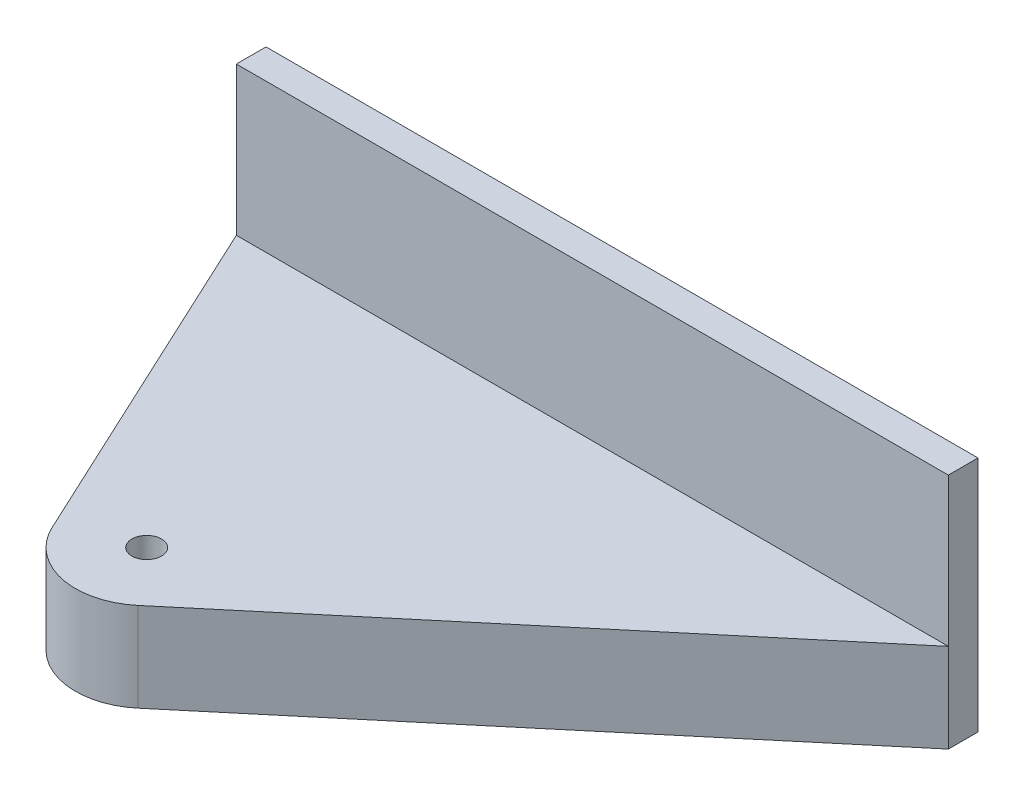
ISO-10303-21;
HEADER;
FILE_DESCRIPTION(('STEP AP214'),'2;1');
FILE_NAME('part.step','',(''),(''),'','','');
FILE_SCHEMA(('AUTOMOTIVE_DESIGN { 1 0 10303 214 1 1 1 1 }'));
ENDSEC;
DATA;
#1=APPLICATION_CONTEXT('core data for automotive mechanical design processes');
#2=APPLICATION_PROTOCOL_DEFINITION('international standard','automotive_design',2000,#1);
#3=PRODUCT_CONTEXT('',#1,'mechanical');
#4=PRODUCT('Part','Part','',(#3));
#5=PRODUCT_RELATED_PRODUCT_CATEGORY('part','',(#4));
#6=PRODUCT_DEFINITION_FORMATION('','',#4);
#7=PRODUCT_DEFINITION_CONTEXT('part definition',#1,'design');
#8=PRODUCT_DEFINITION('design','',#6,#7);
#9=PRODUCT_DEFINITION_SHAPE('','',#8);
#10=(LENGTH_UNIT() NAMED_UNIT(*) SI_UNIT(.MILLI.,.METRE.));
#11=(NAMED_UNIT(*) PLANE_ANGLE_UNIT() SI_UNIT($,.RADIAN.));
#12=(NAMED_UNIT(*) SI_UNIT($,.STERADIAN.) SOLID_ANGLE_UNIT());
#13=UNCERTAINTY_MEASURE_WITH_UNIT(LENGTH_MEASURE(1.E-05),#10,'distance_accuracy_value','');
#14=(GEOMETRIC_REPRESENTATION_CONTEXT(3) GLOBAL_UNCERTAINTY_ASSIGNED_CONTEXT((#13)) GLOBAL_UNIT_ASSIGNED_CONTEXT((#10,
#11,#12)) REPRESENTATION_CONTEXT('',''));
#15=CARTESIAN_POINT('',(0.,0.,0.));
#16=DIRECTION('',(0.,0.,1.));
#17=DIRECTION('',(1.,0.,0.));
#18=AXIS2_PLACEMENT_3D('',#15,#16,#17);
#19=CARTESIAN_POINT('',(0.,0.,3.175));
#20=DIRECTION('',(-1.,0.,0.));
#21=DIRECTION('',(0.,0.,1.));
#22=AXIS2_PLACEMENT_3D('',#19,#20,#21);
#23=PLANE('',#22);
#24=DIRECTION('',(0.,1.,0.));
#25=VECTOR('',#24,1.);
#26=CARTESIAN_POINT('',(0.,0.,3.175));
#27=LINE('',#26,#25);
#28=CARTESIAN_POINT('',(0.,9.525,3.175));
#29=VERTEX_POINT('',#28);
#30=CARTESIAN_POINT('',(0.,25.4,3.175));
#31=VERTEX_POINT('',#30);
#32=EDGE_CURVE('E135',#29,#31,#27,.T.);
#33=ORIENTED_EDGE('',*,*,#32,.F.);
#34=CARTESIAN_POINT('',(0.,0.,3.175));
#35=VERTEX_POINT('',#34);
#36=EDGE_CURVE('E117',#35,#29,#27,.T.);
#37=ORIENTED_EDGE('',*,*,#36,.F.);
#38=DIRECTION('',(0.,0.,-1.));
#39=VECTOR('',#38,1.);
#40=CARTESIAN_POINT('',(0.,0.,3.175));
#41=LINE('',#40,#39);
#42=CARTESIAN_POINT('',(0.,0.,0.));
#43=VERTEX_POINT('',#42);
#44=EDGE_CURVE('E139',#35,#43,#41,.T.);
#45=ORIENTED_EDGE('',*,*,#44,.T.);
#46=DIRECTION('',(0.,1.,0.));
#47=VECTOR('',#46,1.);
#48=CARTESIAN_POINT('',(0.,0.,0.));
#49=LINE('',#48,#47);
#50=CARTESIAN_POINT('',(0.,25.4,0.));
#51=VERTEX_POINT('',#50);
#52=EDGE_CURVE('E132',#43,#51,#49,.T.);
#53=ORIENTED_EDGE('',*,*,#52,.T.);
#54=DIRECTION('',(0.,0.,-1.));
#55=VECTOR('',#54,1.);
#56=CARTESIAN_POINT('',(0.,25.4,3.175));
#57=LINE('',#56,#55);
#58=EDGE_CURVE('E11',#31,#51,#57,.T.);
#59=ORIENTED_EDGE('',*,*,#58,.F.);
#60=EDGE_LOOP('',(#33,#37,#45,#53,#59));
#61=FACE_BOUND('',#60,.T.);
#62=ADVANCED_FACE('F35',(#61),#23,.F.);
#63=CARTESIAN_POINT('',(0.,25.4,3.175));
#64=DIRECTION('',(0.,-1.,0.));
#65=DIRECTION('',(1.,0.,0.));
#66=AXIS2_PLACEMENT_3D('',#63,#64,#65);
#67=PLANE('',#66);
#68=DIRECTION('',(-1.,0.,0.));
#69=VECTOR('',#68,1.);
#70=CARTESIAN_POINT('',(0.,25.4,0.));
#71=LINE('',#70,#69);
#72=CARTESIAN_POINT('',(-76.2,25.4,0.));
#73=VERTEX_POINT('',#72);
#74=EDGE_CURVE('E141',#51,#73,#71,.T.);
#75=ORIENTED_EDGE('',*,*,#74,.T.);
#76=DIRECTION('',(0.,0.,-1.));
#77=VECTOR('',#76,1.);
#78=CARTESIAN_POINT('',(-76.2,25.4,3.175));
#79=LINE('',#78,#77);
#80=CARTESIAN_POINT('',(-76.2,25.4,3.175));
#81=VERTEX_POINT('',#80);
#82=EDGE_CURVE('E43',#81,#73,#79,.T.);
#83=ORIENTED_EDGE('',*,*,#82,.F.);
#84=DIRECTION('',(-1.,0.,0.));
#85=VECTOR('',#84,1.);
#86=CARTESIAN_POINT('',(0.,25.4,3.175));
#87=LINE('',#86,#85);
#88=EDGE_CURVE('E134',#31,#81,#87,.T.);
#89=ORIENTED_EDGE('',*,*,#88,.F.);
#90=ORIENTED_EDGE('',*,*,#58,.T.);
#91=EDGE_LOOP('',(#75,#83,#89,#90));
#92=FACE_BOUND('',#91,.T.);
#93=ADVANCED_FACE('F169',(#92),#67,.F.);
#94=CARTESIAN_POINT('',(-76.2,0.,3.175));
#95=DIRECTION('',(1.,0.,0.));
#96=DIRECTION('',(0.,0.,-1.));
#97=AXIS2_PLACEMENT_3D('',#94,#95,#96);
#98=PLANE('',#97);
#99=DIRECTION('',(0.,-1.,0.));
#100=VECTOR('',#99,1.);
#101=CARTESIAN_POINT('',(-76.2,0.,0.));
#102=LINE('',#101,#100);
#103=CARTESIAN_POINT('',(-76.2,0.,0.));
#104=VERTEX_POINT('',#103);
#105=EDGE_CURVE('E143',#73,#104,#102,.T.);
#106=ORIENTED_EDGE('',*,*,#105,.T.);
#107=DIRECTION('',(0.,0.,-1.));
#108=VECTOR('',#107,1.);
#109=CARTESIAN_POINT('',(-76.2,0.,3.175));
#110=LINE('',#109,#108);
#111=CARTESIAN_POINT('',(-76.2,0.,3.175));
#112=VERTEX_POINT('',#111);
#113=EDGE_CURVE('E149',#112,#104,#110,.T.);
#114=ORIENTED_EDGE('',*,*,#113,.F.);
#115=DIRECTION('',(0.,-1.,0.));
#116=VECTOR('',#115,1.);
#117=CARTESIAN_POINT('',(-76.2,9.52499999999999,3.175));
#118=LINE('',#117,#116);
#119=CARTESIAN_POINT('',(-76.2,9.525,3.175));
#120=VERTEX_POINT('',#119);
#121=EDGE_CURVE('E50',#120,#112,#118,.T.);
#122=ORIENTED_EDGE('',*,*,#121,.F.);
#123=DIRECTION('',(0.,-1.,0.));
#124=VECTOR('',#123,1.);
#125=CARTESIAN_POINT('',(-76.2,0.,3.175));
#126=LINE('',#125,#124);
#127=EDGE_CURVE('E137',#81,#120,#126,.T.);
#128=ORIENTED_EDGE('',*,*,#127,.F.);
#129=ORIENTED_EDGE('',*,*,#82,.T.);
#130=EDGE_LOOP('',(#106,#114,#122,#128,#129));
#131=FACE_BOUND('',#130,.T.);
#132=ADVANCED_FACE('F155',(#131),#98,.F.);
#133=CARTESIAN_POINT('',(0.,0.,3.175));
#134=DIRECTION('',(0.,1.,0.));
#135=DIRECTION('',(-1.,0.,0.));
#136=AXIS2_PLACEMENT_3D('',#133,#134,#135);
#137=PLANE('',#136);
#138=CARTESIAN_POINT('',(-52.060542210601,0.,36.9117782230927));
#139=DIRECTION('',(0.,1.,0.));
#140=DIRECTION('',(-1.,0.,0.));
#141=AXIS2_PLACEMENT_3D('',#138,#139,#140);
#142=CIRCLE('',#141,1.5875);
#143=CARTESIAN_POINT('',(-53.648042210601,0.,36.9117782230927));
#144=VERTEX_POINT('',#143);
#145=EDGE_CURVE('E123',#144,#144,#142,.F.);
#146=ORIENTED_EDGE('',*,*,#145,.F.);
#147=EDGE_LOOP('',(#146));
#148=FACE_BOUND('',#147,.T.);
#149=DIRECTION('',(1.,0.,0.));
#150=VECTOR('',#149,1.);
#151=CARTESIAN_POINT('',(0.,0.,0.));
#152=LINE('',#151,#150);
#153=EDGE_CURVE('E145',#104,#43,#152,.T.);
#154=ORIENTED_EDGE('',*,*,#153,.T.);
#155=ORIENTED_EDGE('',*,*,#44,.F.);
#156=DIRECTION('',(-0.766044443118977,0.,0.642787609686541));
#157=VECTOR('',#156,1.);
#158=CARTESIAN_POINT('',(-47.1625006247896,0.,42.7490368796593));
#159=LINE('',#158,#157);
#160=CARTESIAN_POINT('',(-47.1625006247896,0.,42.7490368796593));
#161=VERTEX_POINT('',#160);
#162=EDGE_CURVE('E126',#35,#161,#159,.T.);
#163=ORIENTED_EDGE('',*,*,#162,.T.);
#164=CARTESIAN_POINT('',(-52.060542210601,0.,36.9117782230927));
#165=DIRECTION('',(0.,-1.,0.));
#166=DIRECTION('',(-1.,0.,0.));
#167=AXIS2_PLACEMENT_3D('',#164,#165,#166);
#168=CIRCLE('',#167,7.62);
#169=CARTESIAN_POINT('',(-58.9666075478203,0.,40.1321293775568));
#170=VERTEX_POINT('',#169);
#171=EDGE_CURVE('E100',#161,#170,#168,.T.);
#172=ORIENTED_EDGE('',*,*,#171,.T.);
#173=DIRECTION('',(-0.422618261740697,0.,-0.906307787036651));
#174=VECTOR('',#173,1.);
#175=CARTESIAN_POINT('',(-76.2,0.,3.175));
#176=LINE('',#175,#174);
#177=EDGE_CURVE('E118',#170,#112,#176,.T.);
#178=ORIENTED_EDGE('',*,*,#177,.T.);
#179=ORIENTED_EDGE('',*,*,#113,.T.);
#180=EDGE_LOOP('',(#154,#155,#163,#172,#178,#179));
#181=FACE_BOUND('',#180,.T.);
#182=ADVANCED_FACE('F165',(#148,#181),#137,.F.);
#183=CARTESIAN_POINT('',(0.,0.,3.175));
#184=DIRECTION('',(0.,0.,1.));
#185=DIRECTION('',(1.,0.,0.));
#186=AXIS2_PLACEMENT_3D('',#183,#184,#185);
#187=PLANE('',#186);
#188=DIRECTION('',(-1.,0.,0.));
#189=VECTOR('',#188,1.);
#190=CARTESIAN_POINT('',(0.,9.525,3.175));
#191=LINE('',#190,#189);
#192=EDGE_CURVE('E57',#29,#120,#191,.T.);
#193=ORIENTED_EDGE('',*,*,#192,.F.);
#194=ORIENTED_EDGE('',*,*,#32,.T.);
#195=ORIENTED_EDGE('',*,*,#88,.T.);
#196=ORIENTED_EDGE('',*,*,#127,.T.);
#197=EDGE_LOOP('',(#193,#194,#195,#196));
#198=FACE_BOUND('',#197,.T.);
#199=ADVANCED_FACE('F168',(#198),#187,.T.);
#200=CARTESIAN_POINT('',(0.,0.,0.));
#201=DIRECTION('',(0.,0.,1.));
#202=DIRECTION('',(1.,0.,0.));
#203=AXIS2_PLACEMENT_3D('',#200,#201,#202);
#204=PLANE('',#203);
#205=ORIENTED_EDGE('',*,*,#74,.F.);
#206=ORIENTED_EDGE('',*,*,#52,.F.);
#207=ORIENTED_EDGE('',*,*,#153,.F.);
#208=ORIENTED_EDGE('',*,*,#105,.F.);
#209=EDGE_LOOP('',(#205,#206,#207,#208));
#210=FACE_BOUND('',#209,.T.);
#211=ADVANCED_FACE('F161',(#210),#204,.F.);
#212=CARTESIAN_POINT('',(-76.2,9.52499999999999,3.175));
#213=DIRECTION('',(-0.906307787036651,0.,0.422618261740697));
#214=DIRECTION('',(0.422618261740697,0.,0.906307787036651));
#215=AXIS2_PLACEMENT_3D('',#212,#213,#214);
#216=PLANE('',#215);
#217=ORIENTED_EDGE('',*,*,#177,.F.);
#218=DIRECTION('',(0.,-1.,0.));
#219=VECTOR('',#218,1.);
#220=CARTESIAN_POINT('',(-58.9666075478203,9.52499999999999,40.1321293775568));
#221=LINE('',#220,#219);
#222=CARTESIAN_POINT('',(-58.9666075478203,9.52499999999999,40.1321293775568));
#223=VERTEX_POINT('',#222);
#224=EDGE_CURVE('E105',#223,#170,#221,.T.);
#225=ORIENTED_EDGE('',*,*,#224,.F.);
#226=DIRECTION('',(-0.422618261740697,0.,-0.906307787036651));
#227=VECTOR('',#226,1.);
#228=CARTESIAN_POINT('',(-76.2,9.52499999999999,3.175));
#229=LINE('',#228,#227);
#230=EDGE_CURVE('E106',#223,#120,#229,.T.);
#231=ORIENTED_EDGE('',*,*,#230,.T.);
#232=ORIENTED_EDGE('',*,*,#121,.T.);
#233=EDGE_LOOP('',(#217,#225,#231,#232));
#234=FACE_BOUND('',#233,.T.);
#235=ADVANCED_FACE('F182',(#234),#216,.T.);
#236=CARTESIAN_POINT('',(-52.060542210601,9.52499999999999,36.9117782230927));
#237=DIRECTION('',(0.,-1.,0.));
#238=DIRECTION('',(1.,0.,0.));
#239=AXIS2_PLACEMENT_3D('',#236,#237,#238);
#240=CYLINDRICAL_SURFACE('',#239,7.62);
#241=ORIENTED_EDGE('',*,*,#171,.F.);
#242=DIRECTION('',(0.,-1.,0.));
#243=VECTOR('',#242,1.);
#244=CARTESIAN_POINT('',(-47.1625006247896,9.52499999999999,42.7490368796593));
#245=LINE('',#244,#243);
#246=CARTESIAN_POINT('',(-47.1625006247896,9.52499999999999,42.7490368796593));
#247=VERTEX_POINT('',#246);
#248=EDGE_CURVE('E95',#247,#161,#245,.T.);
#249=ORIENTED_EDGE('',*,*,#248,.F.);
#250=CARTESIAN_POINT('',(-52.060542210601,9.52499999999999,36.9117782230927));
#251=DIRECTION('',(0.,-1.,0.));
#252=DIRECTION('',(-1.,0.,0.));
#253=AXIS2_PLACEMENT_3D('',#250,#251,#252);
#254=CIRCLE('',#253,7.62);
#255=EDGE_CURVE('E98',#247,#223,#254,.T.);
#256=ORIENTED_EDGE('',*,*,#255,.T.);
#257=ORIENTED_EDGE('',*,*,#224,.T.);
#258=EDGE_LOOP('',(#241,#249,#256,#257));
#259=FACE_BOUND('',#258,.T.);
#260=ADVANCED_FACE('F97',(#259),#240,.T.);
#261=CARTESIAN_POINT('',(-47.1625006247896,9.52499999999999,42.7490368796593));
#262=DIRECTION('',(0.642787609686541,0.,0.766044443118977));
#263=DIRECTION('',(0.766044443118977,0.,-0.642787609686541));
#264=AXIS2_PLACEMENT_3D('',#261,#262,#263);
#265=PLANE('',#264);
#266=ORIENTED_EDGE('',*,*,#162,.F.);
#267=ORIENTED_EDGE('',*,*,#36,.T.);
#268=DIRECTION('',(-0.766044443118977,0.,0.642787609686541));
#269=VECTOR('',#268,1.);
#270=CARTESIAN_POINT('',(-47.1625006247896,9.52499999999999,42.7490368796593));
#271=LINE('',#270,#269);
#272=EDGE_CURVE('E112',#29,#247,#271,.T.);
#273=ORIENTED_EDGE('',*,*,#272,.T.);
#274=ORIENTED_EDGE('',*,*,#248,.T.);
#275=EDGE_LOOP('',(#266,#267,#273,#274));
#276=FACE_BOUND('',#275,.T.);
#277=ADVANCED_FACE('F116',(#276),#265,.T.);
#278=CARTESIAN_POINT('',(-52.060542210601,9.52499999999999,36.9117782230927));
#279=DIRECTION('',(0.,1.,0.));
#280=DIRECTION('',(-1.,0.,0.));
#281=AXIS2_PLACEMENT_3D('',#278,#279,#280);
#282=PLANE('',#281);
#283=CARTESIAN_POINT('',(-52.060542210601,9.52499999999999,36.9117782230927));
#284=DIRECTION('',(0.,1.,0.));
#285=DIRECTION('',(-1.,0.,0.));
#286=AXIS2_PLACEMENT_3D('',#283,#284,#285);
#287=CIRCLE('',#286,1.5875);
#288=CARTESIAN_POINT('',(-53.648042210601,9.52499999999999,36.9117782230927));
#289=VERTEX_POINT('',#288);
#290=EDGE_CURVE('E38',#289,#289,#287,.T.);
#291=ORIENTED_EDGE('',*,*,#290,.F.);
#292=EDGE_LOOP('',(#291));
#293=FACE_BOUND('',#292,.T.);
#294=ORIENTED_EDGE('',*,*,#272,.F.);
#295=ORIENTED_EDGE('',*,*,#192,.T.);
#296=ORIENTED_EDGE('',*,*,#230,.F.);
#297=ORIENTED_EDGE('',*,*,#255,.F.);
#298=EDGE_LOOP('',(#294,#295,#296,#297));
#299=FACE_BOUND('',#298,.T.);
#300=ADVANCED_FACE('F111',(#293,#299),#282,.T.);
#301=CARTESIAN_POINT('',(-52.060542210601,-4.49012806053458,36.9117782230927));
#302=DIRECTION('',(0.,1.,0.));
#303=DIRECTION('',(-1.,0.,0.));
#304=AXIS2_PLACEMENT_3D('',#301,#302,#303);
#305=CYLINDRICAL_SURFACE('',#304,1.5875);
#306=ORIENTED_EDGE('',*,*,#290,.T.);
#307=EDGE_LOOP('',(#306));
#308=FACE_BOUND('',#307,.T.);
#309=ORIENTED_EDGE('',*,*,#145,.T.);
#310=EDGE_LOOP('',(#309));
#311=FACE_BOUND('',#310,.T.);
#312=ADVANCED_FACE('F194',(#308,#311),#305,.F.);
#313=CLOSED_SHELL('',(#62,#93,#132,#182,#199,#211,#235,#260,#277,#300,#312));
#314=MANIFOLD_SOLID_BREP('B2',#313);
#315=ADVANCED_BREP_SHAPE_REPRESENTATION('',(#18,#314),#14);
#316=SHAPE_DEFINITION_REPRESENTATION(#9,#315);
ENDSEC;
END-ISO-10303-21;
